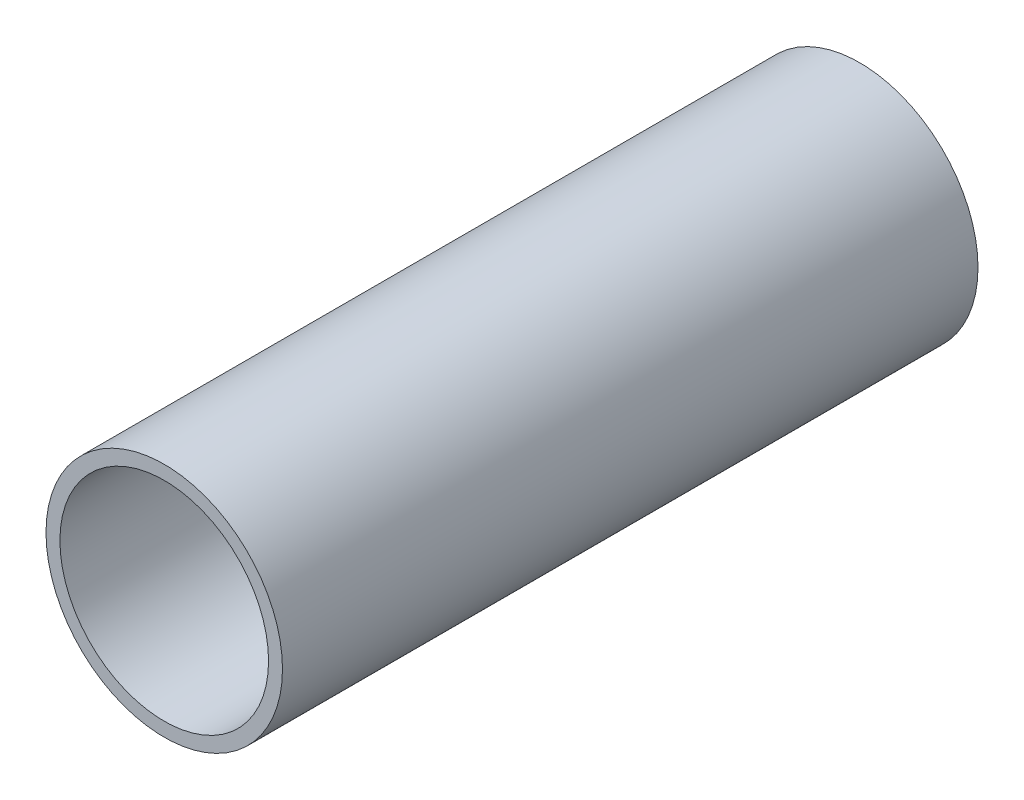
ISO-10303-21;
HEADER;
FILE_DESCRIPTION(('STEP AP214'),'2;1');
FILE_NAME('part.step','',(''),(''),'','','');
FILE_SCHEMA(('AUTOMOTIVE_DESIGN { 1 0 10303 214 1 1 1 1 }'));
ENDSEC;
DATA;
#1=APPLICATION_CONTEXT('core data for automotive mechanical design processes');
#2=APPLICATION_PROTOCOL_DEFINITION('international standard','automotive_design',2000,#1);
#3=PRODUCT_CONTEXT('',#1,'mechanical');
#4=PRODUCT('Part','Part','',(#3));
#5=PRODUCT_RELATED_PRODUCT_CATEGORY('part','',(#4));
#6=PRODUCT_DEFINITION_FORMATION('','',#4);
#7=PRODUCT_DEFINITION_CONTEXT('part definition',#1,'design');
#8=PRODUCT_DEFINITION('design','',#6,#7);
#9=PRODUCT_DEFINITION_SHAPE('','',#8);
#10=(LENGTH_UNIT() NAMED_UNIT(*) SI_UNIT(.MILLI.,.METRE.));
#11=(NAMED_UNIT(*) PLANE_ANGLE_UNIT() SI_UNIT($,.RADIAN.));
#12=(NAMED_UNIT(*) SI_UNIT($,.STERADIAN.) SOLID_ANGLE_UNIT());
#13=UNCERTAINTY_MEASURE_WITH_UNIT(LENGTH_MEASURE(1.E-05),#10,'distance_accuracy_value','');
#14=(GEOMETRIC_REPRESENTATION_CONTEXT(3) GLOBAL_UNCERTAINTY_ASSIGNED_CONTEXT((#13)) GLOBAL_UNIT_ASSIGNED_CONTEXT((#10,
#11,#12)) REPRESENTATION_CONTEXT('',''));
#15=CARTESIAN_POINT('',(0.,0.,0.));
#16=DIRECTION('',(0.,0.,1.));
#17=DIRECTION('',(1.,0.,0.));
#18=AXIS2_PLACEMENT_3D('',#15,#16,#17);
#19=CARTESIAN_POINT('',(0.,0.,100.));
#20=DIRECTION('',(0.,0.,1.));
#21=DIRECTION('',(1.,0.,0.));
#22=AXIS2_PLACEMENT_3D('',#19,#20,#21);
#23=PLANE('',#22);
#24=CARTESIAN_POINT('',(0.,0.,100.));
#25=DIRECTION('',(0.,0.,1.));
#26=DIRECTION('',(1.,0.,0.));
#27=AXIS2_PLACEMENT_3D('',#24,#25,#26);
#28=CIRCLE('',#27,17.);
#29=CARTESIAN_POINT('',(17.,0.,100.));
#30=VERTEX_POINT('',#29);
#31=EDGE_CURVE('E10',#30,#30,#28,.T.);
#32=ORIENTED_EDGE('',*,*,#31,.T.);
#33=EDGE_LOOP('',(#32));
#34=FACE_BOUND('',#33,.T.);
#35=CARTESIAN_POINT('',(0.,0.,100.));
#36=DIRECTION('',(0.,0.,1.));
#37=DIRECTION('',(1.,0.,0.));
#38=AXIS2_PLACEMENT_3D('',#35,#36,#37);
#39=CIRCLE('',#38,15.);
#40=CARTESIAN_POINT('',(15.,0.,100.));
#41=VERTEX_POINT('',#40);
#42=EDGE_CURVE('E42',#41,#41,#39,.T.);
#43=ORIENTED_EDGE('',*,*,#42,.F.);
#44=EDGE_LOOP('',(#43));
#45=FACE_BOUND('',#44,.T.);
#46=ADVANCED_FACE('F31',(#34,#45),#23,.T.);
#47=CARTESIAN_POINT('',(0.,0.,0.));
#48=DIRECTION('',(0.,0.,1.));
#49=DIRECTION('',(1.,0.,0.));
#50=AXIS2_PLACEMENT_3D('',#47,#48,#49);
#51=PLANE('',#50);
#52=CARTESIAN_POINT('',(0.,0.,0.));
#53=DIRECTION('',(0.,0.,1.));
#54=DIRECTION('',(1.,0.,0.));
#55=AXIS2_PLACEMENT_3D('',#52,#53,#54);
#56=CIRCLE('',#55,17.);
#57=CARTESIAN_POINT('',(17.,0.,0.));
#58=VERTEX_POINT('',#57);
#59=EDGE_CURVE('E35',#58,#58,#56,.T.);
#60=ORIENTED_EDGE('',*,*,#59,.F.);
#61=EDGE_LOOP('',(#60));
#62=FACE_BOUND('',#61,.T.);
#63=CARTESIAN_POINT('',(0.,0.,0.));
#64=DIRECTION('',(0.,0.,1.));
#65=DIRECTION('',(1.,0.,0.));
#66=AXIS2_PLACEMENT_3D('',#63,#64,#65);
#67=CIRCLE('',#66,15.);
#68=CARTESIAN_POINT('',(15.,0.,0.));
#69=VERTEX_POINT('',#68);
#70=EDGE_CURVE('E44',#69,#69,#67,.T.);
#71=ORIENTED_EDGE('',*,*,#70,.T.);
#72=EDGE_LOOP('',(#71));
#73=FACE_BOUND('',#72,.T.);
#74=ADVANCED_FACE('F54',(#62,#73),#51,.F.);
#75=CARTESIAN_POINT('',(0.,0.,100.));
#76=DIRECTION('',(0.,0.,-1.));
#77=DIRECTION('',(-1.,0.,0.));
#78=AXIS2_PLACEMENT_3D('',#75,#76,#77);
#79=CYLINDRICAL_SURFACE('',#78,17.);
#80=ORIENTED_EDGE('',*,*,#31,.F.);
#81=EDGE_LOOP('',(#80));
#82=FACE_BOUND('',#81,.T.);
#83=ORIENTED_EDGE('',*,*,#59,.T.);
#84=EDGE_LOOP('',(#83));
#85=FACE_BOUND('',#84,.T.);
#86=ADVANCED_FACE('F33',(#82,#85),#79,.T.);
#87=CARTESIAN_POINT('',(0.,0.,100.));
#88=DIRECTION('',(0.,0.,-1.));
#89=DIRECTION('',(-1.,0.,0.));
#90=AXIS2_PLACEMENT_3D('',#87,#88,#89);
#91=CYLINDRICAL_SURFACE('',#90,15.);
#92=ORIENTED_EDGE('',*,*,#42,.T.);
#93=EDGE_LOOP('',(#92));
#94=FACE_BOUND('',#93,.T.);
#95=ORIENTED_EDGE('',*,*,#70,.F.);
#96=EDGE_LOOP('',(#95));
#97=FACE_BOUND('',#96,.T.);
#98=ADVANCED_FACE('F50',(#94,#97),#91,.F.);
#99=CLOSED_SHELL('',(#46,#74,#86,#98));
#100=MANIFOLD_SOLID_BREP('B2',#99);
#101=ADVANCED_BREP_SHAPE_REPRESENTATION('',(#18,#100),#14);
#102=SHAPE_DEFINITION_REPRESENTATION(#9,#101);
ENDSEC;
END-ISO-10303-21;
